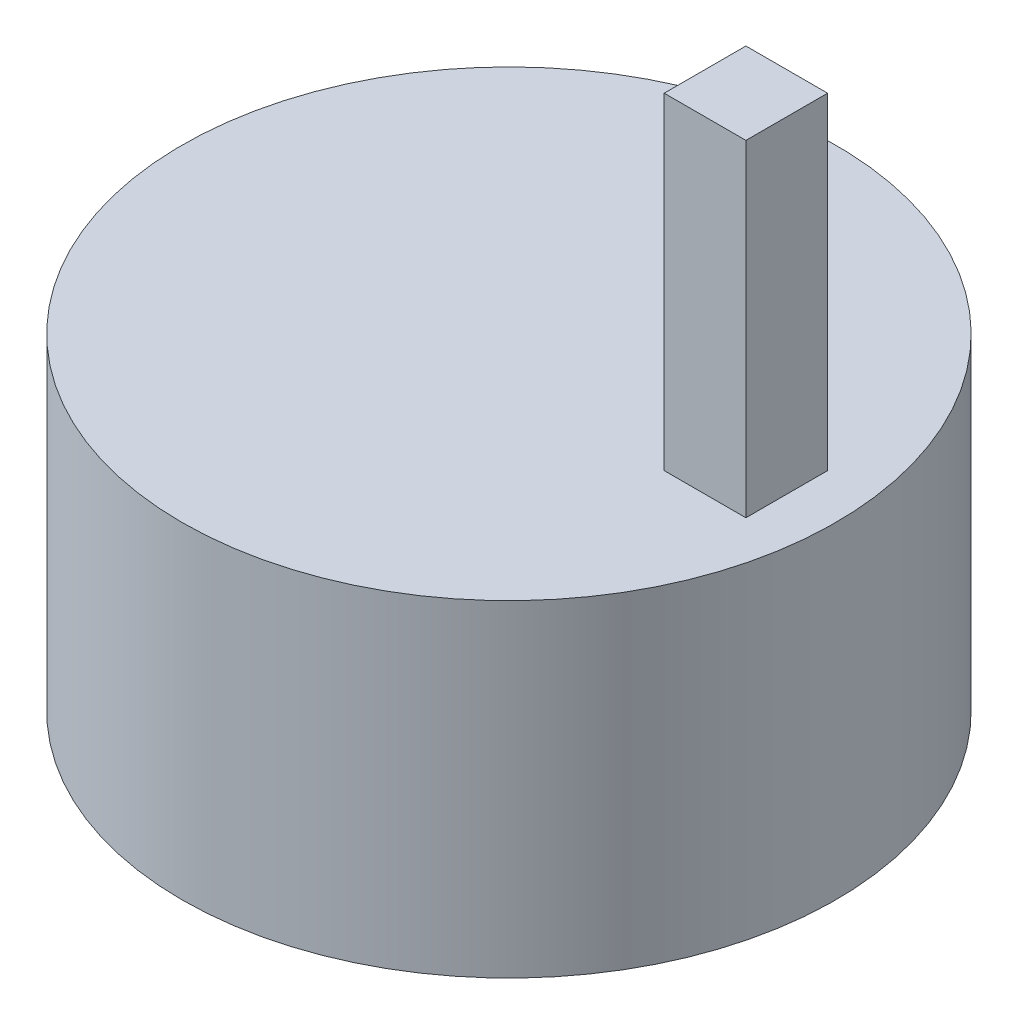
ISO-10303-21;
HEADER;
FILE_DESCRIPTION(('STEP AP214'),'2;1');
FILE_NAME('part.step','',(''),(''),'','','');
FILE_SCHEMA(('AUTOMOTIVE_DESIGN { 1 0 10303 214 1 1 1 1 }'));
ENDSEC;
DATA;
#1=APPLICATION_CONTEXT('core data for automotive mechanical design processes');
#2=APPLICATION_PROTOCOL_DEFINITION('international standard','automotive_design',2000,#1);
#3=PRODUCT_CONTEXT('',#1,'mechanical');
#4=PRODUCT('Part','Part','',(#3));
#5=PRODUCT_RELATED_PRODUCT_CATEGORY('part','',(#4));
#6=PRODUCT_DEFINITION_FORMATION('','',#4);
#7=PRODUCT_DEFINITION_CONTEXT('part definition',#1,'design');
#8=PRODUCT_DEFINITION('design','',#6,#7);
#9=PRODUCT_DEFINITION_SHAPE('','',#8);
#10=(LENGTH_UNIT() NAMED_UNIT(*) SI_UNIT(.MILLI.,.METRE.));
#11=(NAMED_UNIT(*) PLANE_ANGLE_UNIT() SI_UNIT($,.RADIAN.));
#12=(NAMED_UNIT(*) SI_UNIT($,.STERADIAN.) SOLID_ANGLE_UNIT());
#13=UNCERTAINTY_MEASURE_WITH_UNIT(LENGTH_MEASURE(1.E-05),#10,'distance_accuracy_value','');
#14=(GEOMETRIC_REPRESENTATION_CONTEXT(3) GLOBAL_UNCERTAINTY_ASSIGNED_CONTEXT((#13)) GLOBAL_UNIT_ASSIGNED_CONTEXT((#10,
#11,#12)) REPRESENTATION_CONTEXT('',''));
#15=CARTESIAN_POINT('',(0.,0.,0.));
#16=DIRECTION('',(0.,0.,1.));
#17=DIRECTION('',(1.,0.,0.));
#18=AXIS2_PLACEMENT_3D('',#15,#16,#17);
#19=CARTESIAN_POINT('',(0.,20.,0.));
#20=DIRECTION('',(0.,1.,0.));
#21=DIRECTION('',(0.,0.,1.));
#22=AXIS2_PLACEMENT_3D('',#19,#20,#21);
#23=PLANE('',#22);
#24=CARTESIAN_POINT('',(0.,20.,0.));
#25=DIRECTION('',(0.,1.,0.));
#26=DIRECTION('',(0.,0.,1.));
#27=AXIS2_PLACEMENT_3D('',#24,#25,#26);
#28=CIRCLE('',#27,20.);
#29=CARTESIAN_POINT('',(0.,20.,20.));
#30=VERTEX_POINT('',#29);
#31=EDGE_CURVE('E11',#30,#30,#28,.T.);
#32=ORIENTED_EDGE('',*,*,#31,.T.);
#33=EDGE_LOOP('',(#32));
#34=FACE_BOUND('',#33,.T.);
#35=DIRECTION('',(1.,0.,0.));
#36=VECTOR('',#35,1.);
#37=CARTESIAN_POINT('',(12.,20.,2.5));
#38=LINE('',#37,#36);
#39=CARTESIAN_POINT('',(12.,20.,2.5));
#40=VERTEX_POINT('',#39);
#41=CARTESIAN_POINT('',(17.,20.,2.5));
#42=VERTEX_POINT('',#41);
#43=EDGE_CURVE('E97',#40,#42,#38,.T.);
#44=ORIENTED_EDGE('',*,*,#43,.F.);
#45=DIRECTION('',(0.,0.,1.));
#46=VECTOR('',#45,1.);
#47=CARTESIAN_POINT('',(12.,20.,2.5));
#48=LINE('',#47,#46);
#49=CARTESIAN_POINT('',(12.,20.,-2.5));
#50=VERTEX_POINT('',#49);
#51=EDGE_CURVE('E111',#50,#40,#48,.T.);
#52=ORIENTED_EDGE('',*,*,#51,.F.);
#53=DIRECTION('',(-1.,0.,0.));
#54=VECTOR('',#53,1.);
#55=CARTESIAN_POINT('',(12.,20.,-2.5));
#56=LINE('',#55,#54);
#57=CARTESIAN_POINT('',(17.,20.,-2.5));
#58=VERTEX_POINT('',#57);
#59=EDGE_CURVE('E77',#58,#50,#56,.T.);
#60=ORIENTED_EDGE('',*,*,#59,.F.);
#61=DIRECTION('',(0.,0.,-1.));
#62=VECTOR('',#61,1.);
#63=CARTESIAN_POINT('',(17.,20.,2.5));
#64=LINE('',#63,#62);
#65=EDGE_CURVE('E117',#42,#58,#64,.T.);
#66=ORIENTED_EDGE('',*,*,#65,.F.);
#67=EDGE_LOOP('',(#44,#52,#60,#66));
#68=FACE_BOUND('',#67,.T.);
#69=ADVANCED_FACE('F39',(#34,#68),#23,.T.);
#70=CARTESIAN_POINT('',(0.,20.,0.));
#71=DIRECTION('',(0.,-1.,0.));
#72=DIRECTION('',(0.,0.,-1.));
#73=AXIS2_PLACEMENT_3D('',#70,#71,#72);
#74=CYLINDRICAL_SURFACE('',#73,20.);
#75=ORIENTED_EDGE('',*,*,#31,.F.);
#76=EDGE_LOOP('',(#75));
#77=FACE_BOUND('',#76,.T.);
#78=CARTESIAN_POINT('',(0.,0.,0.));
#79=DIRECTION('',(0.,1.,0.));
#80=DIRECTION('',(0.,0.,1.));
#81=AXIS2_PLACEMENT_3D('',#78,#79,#80);
#82=CIRCLE('',#81,20.);
#83=CARTESIAN_POINT('',(0.,0.,20.));
#84=VERTEX_POINT('',#83);
#85=EDGE_CURVE('E43',#84,#84,#82,.T.);
#86=ORIENTED_EDGE('',*,*,#85,.T.);
#87=EDGE_LOOP('',(#86));
#88=FACE_BOUND('',#87,.T.);
#89=ADVANCED_FACE('F41',(#77,#88),#74,.T.);
#90=CARTESIAN_POINT('',(0.,0.,0.));
#91=DIRECTION('',(0.,1.,0.));
#92=DIRECTION('',(0.,0.,1.));
#93=AXIS2_PLACEMENT_3D('',#90,#91,#92);
#94=PLANE('',#93);
#95=ORIENTED_EDGE('',*,*,#85,.F.);
#96=EDGE_LOOP('',(#95));
#97=FACE_BOUND('',#96,.T.);
#98=ADVANCED_FACE('F132',(#97),#94,.F.);
#99=CARTESIAN_POINT('',(12.,40.,2.5));
#100=DIRECTION('',(1.,0.,0.));
#101=DIRECTION('',(0.,0.,-1.));
#102=AXIS2_PLACEMENT_3D('',#99,#100,#101);
#103=PLANE('',#102);
#104=ORIENTED_EDGE('',*,*,#51,.T.);
#105=DIRECTION('',(0.,-1.,0.));
#106=VECTOR('',#105,1.);
#107=CARTESIAN_POINT('',(12.,40.,2.5));
#108=LINE('',#107,#106);
#109=CARTESIAN_POINT('',(12.,40.,2.5));
#110=VERTEX_POINT('',#109);
#111=EDGE_CURVE('E101',#110,#40,#108,.T.);
#112=ORIENTED_EDGE('',*,*,#111,.F.);
#113=DIRECTION('',(0.,0.,1.));
#114=VECTOR('',#113,1.);
#115=CARTESIAN_POINT('',(12.,40.,2.5));
#116=LINE('',#115,#114);
#117=CARTESIAN_POINT('',(12.,40.,-2.5));
#118=VERTEX_POINT('',#117);
#119=EDGE_CURVE('E89',#118,#110,#116,.T.);
#120=ORIENTED_EDGE('',*,*,#119,.F.);
#121=DIRECTION('',(0.,-1.,0.));
#122=VECTOR('',#121,1.);
#123=CARTESIAN_POINT('',(12.,40.,-2.5));
#124=LINE('',#123,#122);
#125=EDGE_CURVE('E107',#118,#50,#124,.T.);
#126=ORIENTED_EDGE('',*,*,#125,.T.);
#127=EDGE_LOOP('',(#104,#112,#120,#126));
#128=FACE_BOUND('',#127,.T.);
#129=ADVANCED_FACE('F134',(#128),#103,.F.);
#130=CARTESIAN_POINT('',(12.,40.,2.5));
#131=DIRECTION('',(0.,0.,-1.));
#132=DIRECTION('',(-1.,0.,0.));
#133=AXIS2_PLACEMENT_3D('',#130,#131,#132);
#134=PLANE('',#133);
#135=ORIENTED_EDGE('',*,*,#43,.T.);
#136=DIRECTION('',(0.,-1.,0.));
#137=VECTOR('',#136,1.);
#138=CARTESIAN_POINT('',(17.,40.,2.5));
#139=LINE('',#138,#137);
#140=CARTESIAN_POINT('',(17.,40.,2.5));
#141=VERTEX_POINT('',#140);
#142=EDGE_CURVE('E94',#141,#42,#139,.T.);
#143=ORIENTED_EDGE('',*,*,#142,.F.);
#144=DIRECTION('',(1.,0.,0.));
#145=VECTOR('',#144,1.);
#146=CARTESIAN_POINT('',(12.,40.,2.5));
#147=LINE('',#146,#145);
#148=EDGE_CURVE('E84',#110,#141,#147,.T.);
#149=ORIENTED_EDGE('',*,*,#148,.F.);
#150=ORIENTED_EDGE('',*,*,#111,.T.);
#151=EDGE_LOOP('',(#135,#143,#149,#150));
#152=FACE_BOUND('',#151,.T.);
#153=ADVANCED_FACE('F95',(#152),#134,.F.);
#154=CARTESIAN_POINT('',(17.,40.,2.5));
#155=DIRECTION('',(-1.,0.,0.));
#156=DIRECTION('',(0.,0.,1.));
#157=AXIS2_PLACEMENT_3D('',#154,#155,#156);
#158=PLANE('',#157);
#159=ORIENTED_EDGE('',*,*,#65,.T.);
#160=DIRECTION('',(0.,-1.,0.));
#161=VECTOR('',#160,1.);
#162=CARTESIAN_POINT('',(17.,40.,-2.5));
#163=LINE('',#162,#161);
#164=CARTESIAN_POINT('',(17.,40.,-2.5));
#165=VERTEX_POINT('',#164);
#166=EDGE_CURVE('E55',#165,#58,#163,.T.);
#167=ORIENTED_EDGE('',*,*,#166,.F.);
#168=DIRECTION('',(0.,0.,-1.));
#169=VECTOR('',#168,1.);
#170=CARTESIAN_POINT('',(17.,40.,2.5));
#171=LINE('',#170,#169);
#172=EDGE_CURVE('E87',#141,#165,#171,.T.);
#173=ORIENTED_EDGE('',*,*,#172,.F.);
#174=ORIENTED_EDGE('',*,*,#142,.T.);
#175=EDGE_LOOP('',(#159,#167,#173,#174));
#176=FACE_BOUND('',#175,.T.);
#177=ADVANCED_FACE('F103',(#176),#158,.F.);
#178=CARTESIAN_POINT('',(12.,40.,-2.5));
#179=DIRECTION('',(0.,0.,1.));
#180=DIRECTION('',(1.,0.,0.));
#181=AXIS2_PLACEMENT_3D('',#178,#179,#180);
#182=PLANE('',#181);
#183=ORIENTED_EDGE('',*,*,#59,.T.);
#184=ORIENTED_EDGE('',*,*,#125,.F.);
#185=DIRECTION('',(-1.,0.,0.));
#186=VECTOR('',#185,1.);
#187=CARTESIAN_POINT('',(12.,40.,-2.5));
#188=LINE('',#187,#186);
#189=EDGE_CURVE('E63',#165,#118,#188,.T.);
#190=ORIENTED_EDGE('',*,*,#189,.F.);
#191=ORIENTED_EDGE('',*,*,#166,.T.);
#192=EDGE_LOOP('',(#183,#184,#190,#191));
#193=FACE_BOUND('',#192,.T.);
#194=ADVANCED_FACE('F153',(#193),#182,.F.);
#195=CARTESIAN_POINT('',(0.,40.,0.));
#196=DIRECTION('',(0.,-1.,0.));
#197=DIRECTION('',(0.,0.,-1.));
#198=AXIS2_PLACEMENT_3D('',#195,#196,#197);
#199=PLANE('',#198);
#200=ORIENTED_EDGE('',*,*,#119,.T.);
#201=ORIENTED_EDGE('',*,*,#148,.T.);
#202=ORIENTED_EDGE('',*,*,#172,.T.);
#203=ORIENTED_EDGE('',*,*,#189,.T.);
#204=EDGE_LOOP('',(#200,#201,#202,#203));
#205=FACE_BOUND('',#204,.T.);
#206=ADVANCED_FACE('F85',(#205),#199,.F.);
#207=CLOSED_SHELL('',(#69,#89,#98,#129,#153,#177,#194,#206));
#208=MANIFOLD_SOLID_BREP('B2',#207);
#209=ADVANCED_BREP_SHAPE_REPRESENTATION('',(#18,#208),#14);
#210=SHAPE_DEFINITION_REPRESENTATION(#9,#209);
ENDSEC;
END-ISO-10303-21;
